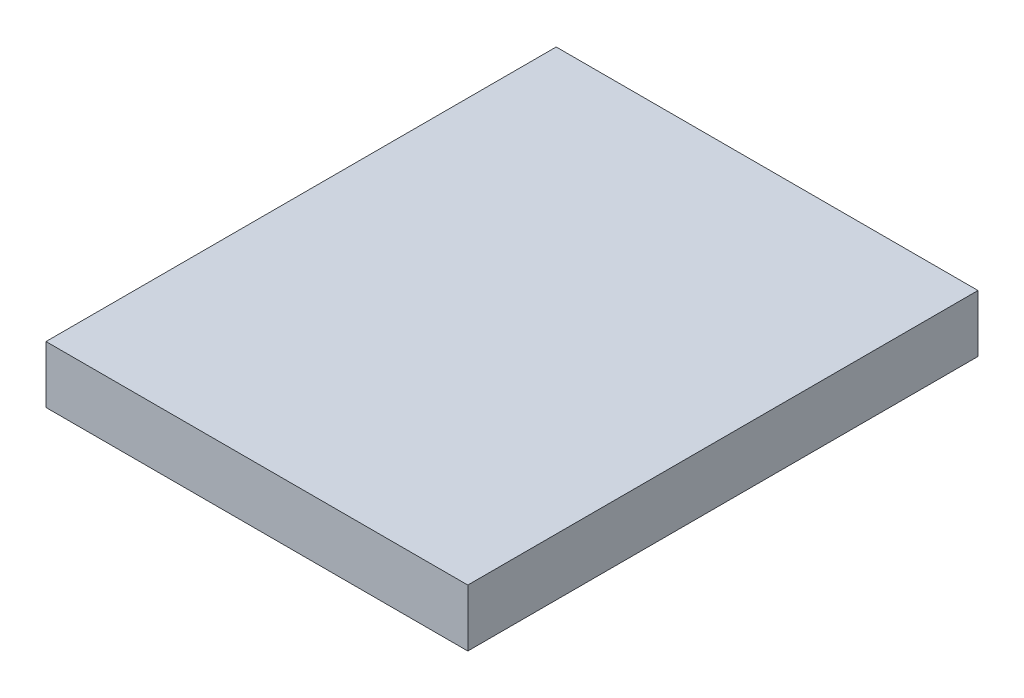
ISO-10303-21;
HEADER;
FILE_DESCRIPTION(('STEP AP214'),'2;1');
FILE_NAME('part.step','',(''),(''),'','','');
FILE_SCHEMA(('AUTOMOTIVE_DESIGN { 1 0 10303 214 1 1 1 1 }'));
ENDSEC;
DATA;
#1=APPLICATION_CONTEXT('core data for automotive mechanical design processes');
#2=APPLICATION_PROTOCOL_DEFINITION('international standard','automotive_design',2000,#1);
#3=PRODUCT_CONTEXT('',#1,'mechanical');
#4=PRODUCT('Part','Part','',(#3));
#5=PRODUCT_RELATED_PRODUCT_CATEGORY('part','',(#4));
#6=PRODUCT_DEFINITION_FORMATION('','',#4);
#7=PRODUCT_DEFINITION_CONTEXT('part definition',#1,'design');
#8=PRODUCT_DEFINITION('design','',#6,#7);
#9=PRODUCT_DEFINITION_SHAPE('','',#8);
#10=(LENGTH_UNIT() NAMED_UNIT(*) SI_UNIT(.MILLI.,.METRE.));
#11=(NAMED_UNIT(*) PLANE_ANGLE_UNIT() SI_UNIT($,.RADIAN.));
#12=(NAMED_UNIT(*) SI_UNIT($,.STERADIAN.) SOLID_ANGLE_UNIT());
#13=UNCERTAINTY_MEASURE_WITH_UNIT(LENGTH_MEASURE(1.E-05),#10,'distance_accuracy_value','');
#14=(GEOMETRIC_REPRESENTATION_CONTEXT(3) GLOBAL_UNCERTAINTY_ASSIGNED_CONTEXT((#13)) GLOBAL_UNIT_ASSIGNED_CONTEXT((#10,
#11,#12)) REPRESENTATION_CONTEXT('',''));
#15=CARTESIAN_POINT('',(0.,0.,0.));
#16=DIRECTION('',(0.,0.,1.));
#17=DIRECTION('',(1.,0.,0.));
#18=AXIS2_PLACEMENT_3D('',#15,#16,#17);
#19=CARTESIAN_POINT('',(0.,150.,669.499999999999));
#20=DIRECTION('',(1.,0.,0.));
#21=DIRECTION('',(0.,0.,-1.));
#22=AXIS2_PLACEMENT_3D('',#19,#20,#21);
#23=PLANE('',#22);
#24=DIRECTION('',(0.,-1.,0.));
#25=VECTOR('',#24,1.);
#26=CARTESIAN_POINT('',(0.,150.,-669.499999999999));
#27=LINE('',#26,#25);
#28=CARTESIAN_POINT('',(0.,150.,-669.499999999999));
#29=VERTEX_POINT('',#28);
#30=CARTESIAN_POINT('',(0.,0.,-669.499999999999));
#31=VERTEX_POINT('',#30);
#32=EDGE_CURVE('E111',#29,#31,#27,.T.);
#33=ORIENTED_EDGE('',*,*,#32,.T.);
#34=DIRECTION('',(0.,0.,-1.));
#35=VECTOR('',#34,1.);
#36=CARTESIAN_POINT('',(0.,0.,669.499999999999));
#37=LINE('',#36,#35);
#38=CARTESIAN_POINT('',(0.,0.,669.499999999999));
#39=VERTEX_POINT('',#38);
#40=EDGE_CURVE('E11',#39,#31,#37,.T.);
#41=ORIENTED_EDGE('',*,*,#40,.F.);
#42=DIRECTION('',(0.,-1.,0.));
#43=VECTOR('',#42,1.);
#44=CARTESIAN_POINT('',(0.,150.,669.499999999999));
#45=LINE('',#44,#43);
#46=CARTESIAN_POINT('',(0.,150.,669.499999999999));
#47=VERTEX_POINT('',#46);
#48=EDGE_CURVE('E93',#47,#39,#45,.T.);
#49=ORIENTED_EDGE('',*,*,#48,.F.);
#50=DIRECTION('',(0.,0.,-1.));
#51=VECTOR('',#50,1.);
#52=CARTESIAN_POINT('',(0.,150.,669.499999999999));
#53=LINE('',#52,#51);
#54=EDGE_CURVE('E60',#47,#29,#53,.T.);
#55=ORIENTED_EDGE('',*,*,#54,.T.);
#56=EDGE_LOOP('',(#33,#41,#49,#55));
#57=FACE_BOUND('',#56,.T.);
#58=ADVANCED_FACE('F43',(#57),#23,.F.);
#59=CARTESIAN_POINT('',(0.,0.,669.499999999999));
#60=DIRECTION('',(0.,1.,0.));
#61=DIRECTION('',(0.,0.,1.));
#62=AXIS2_PLACEMENT_3D('',#59,#60,#61);
#63=PLANE('',#62);
#64=DIRECTION('',(1.,0.,0.));
#65=VECTOR('',#64,1.);
#66=CARTESIAN_POINT('',(0.,0.,-669.499999999999));
#67=LINE('',#66,#65);
#68=CARTESIAN_POINT('',(1106.97250468037,0.,-669.499999999999));
#69=VERTEX_POINT('',#68);
#70=EDGE_CURVE('E99',#31,#69,#67,.T.);
#71=ORIENTED_EDGE('',*,*,#70,.T.);
#72=DIRECTION('',(0.,0.,-1.));
#73=VECTOR('',#72,1.);
#74=CARTESIAN_POINT('',(1106.97250468037,0.,669.499999999999));
#75=LINE('',#74,#73);
#76=CARTESIAN_POINT('',(1106.97250468037,0.,669.499999999999));
#77=VERTEX_POINT('',#76);
#78=EDGE_CURVE('E52',#77,#69,#75,.T.);
#79=ORIENTED_EDGE('',*,*,#78,.F.);
#80=DIRECTION('',(1.,0.,0.));
#81=VECTOR('',#80,1.);
#82=CARTESIAN_POINT('',(0.,0.,669.499999999999));
#83=LINE('',#82,#81);
#84=EDGE_CURVE('E85',#39,#77,#83,.T.);
#85=ORIENTED_EDGE('',*,*,#84,.F.);
#86=ORIENTED_EDGE('',*,*,#40,.T.);
#87=EDGE_LOOP('',(#71,#79,#85,#86));
#88=FACE_BOUND('',#87,.T.);
#89=ADVANCED_FACE('F98',(#88),#63,.F.);
#90=CARTESIAN_POINT('',(1106.97250468037,150.,669.499999999999));
#91=DIRECTION('',(1.,0.,0.));
#92=DIRECTION('',(0.,0.,-1.));
#93=AXIS2_PLACEMENT_3D('',#90,#91,#92);
#94=PLANE('',#93);
#95=DIRECTION('',(0.,-1.,0.));
#96=VECTOR('',#95,1.);
#97=CARTESIAN_POINT('',(1106.97250468037,150.,-669.499999999999));
#98=LINE('',#97,#96);
#99=CARTESIAN_POINT('',(1106.97250468037,150.,-669.499999999999));
#100=VERTEX_POINT('',#99);
#101=EDGE_CURVE('E116',#100,#69,#98,.T.);
#102=ORIENTED_EDGE('',*,*,#101,.F.);
#103=DIRECTION('',(0.,0.,-1.));
#104=VECTOR('',#103,1.);
#105=CARTESIAN_POINT('',(1106.97250468037,150.,669.499999999999));
#106=LINE('',#105,#104);
#107=CARTESIAN_POINT('',(1106.97250468037,150.,669.499999999999));
#108=VERTEX_POINT('',#107);
#109=EDGE_CURVE('E74',#108,#100,#106,.T.);
#110=ORIENTED_EDGE('',*,*,#109,.F.);
#111=DIRECTION('',(0.,-1.,0.));
#112=VECTOR('',#111,1.);
#113=CARTESIAN_POINT('',(1106.97250468037,150.,669.499999999999));
#114=LINE('',#113,#112);
#115=EDGE_CURVE('E92',#108,#77,#114,.T.);
#116=ORIENTED_EDGE('',*,*,#115,.T.);
#117=ORIENTED_EDGE('',*,*,#78,.T.);
#118=EDGE_LOOP('',(#102,#110,#116,#117));
#119=FACE_BOUND('',#118,.T.);
#120=ADVANCED_FACE('F103',(#119),#94,.T.);
#121=CARTESIAN_POINT('',(0.,150.,669.499999999999));
#122=DIRECTION('',(0.,1.,0.));
#123=DIRECTION('',(0.,0.,1.));
#124=AXIS2_PLACEMENT_3D('',#121,#122,#123);
#125=PLANE('',#124);
#126=DIRECTION('',(1.,0.,0.));
#127=VECTOR('',#126,1.);
#128=CARTESIAN_POINT('',(0.,150.,-669.499999999999));
#129=LINE('',#128,#127);
#130=EDGE_CURVE('E119',#29,#100,#129,.T.);
#131=ORIENTED_EDGE('',*,*,#130,.F.);
#132=ORIENTED_EDGE('',*,*,#54,.F.);
#133=DIRECTION('',(1.,0.,0.));
#134=VECTOR('',#133,1.);
#135=CARTESIAN_POINT('',(0.,150.,669.499999999999));
#136=LINE('',#135,#134);
#137=EDGE_CURVE('E105',#47,#108,#136,.T.);
#138=ORIENTED_EDGE('',*,*,#137,.T.);
#139=ORIENTED_EDGE('',*,*,#109,.T.);
#140=EDGE_LOOP('',(#131,#132,#138,#139));
#141=FACE_BOUND('',#140,.T.);
#142=ADVANCED_FACE('F129',(#141),#125,.T.);
#143=CARTESIAN_POINT('',(0.,0.,669.499999999999));
#144=DIRECTION('',(0.,0.,1.));
#145=DIRECTION('',(1.,0.,0.));
#146=AXIS2_PLACEMENT_3D('',#143,#144,#145);
#147=PLANE('',#146);
#148=ORIENTED_EDGE('',*,*,#48,.T.);
#149=ORIENTED_EDGE('',*,*,#84,.T.);
#150=ORIENTED_EDGE('',*,*,#115,.F.);
#151=ORIENTED_EDGE('',*,*,#137,.F.);
#152=EDGE_LOOP('',(#148,#149,#150,#151));
#153=FACE_BOUND('',#152,.T.);
#154=ADVANCED_FACE('F89',(#153),#147,.T.);
#155=CARTESIAN_POINT('',(0.,0.,-669.499999999999));
#156=DIRECTION('',(0.,0.,1.));
#157=DIRECTION('',(1.,0.,0.));
#158=AXIS2_PLACEMENT_3D('',#155,#156,#157);
#159=PLANE('',#158);
#160=ORIENTED_EDGE('',*,*,#32,.F.);
#161=ORIENTED_EDGE('',*,*,#130,.T.);
#162=ORIENTED_EDGE('',*,*,#101,.T.);
#163=ORIENTED_EDGE('',*,*,#70,.F.);
#164=EDGE_LOOP('',(#160,#161,#162,#163));
#165=FACE_BOUND('',#164,.T.);
#166=ADVANCED_FACE('F128',(#165),#159,.F.);
#167=CLOSED_SHELL('',(#58,#89,#120,#142,#154,#166));
#168=MANIFOLD_SOLID_BREP('B2',#167);
#169=ADVANCED_BREP_SHAPE_REPRESENTATION('',(#18,#168),#14);
#170=SHAPE_DEFINITION_REPRESENTATION(#9,#169);
ENDSEC;
END-ISO-10303-21;
